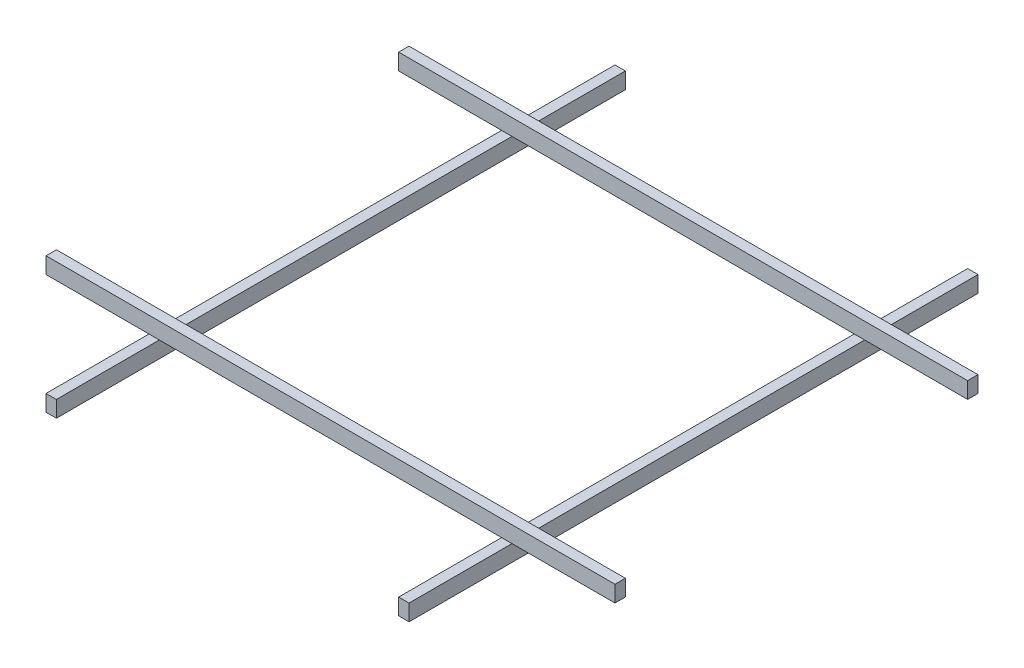
ISO-10303-21;
HEADER;
FILE_DESCRIPTION(('STEP AP214'),'2;1');
FILE_NAME('part.step','',(''),(''),'','','');
FILE_SCHEMA(('AUTOMOTIVE_DESIGN { 1 0 10303 214 1 1 1 1 }'));
ENDSEC;
DATA;
#1=APPLICATION_CONTEXT('core data for automotive mechanical design processes');
#2=APPLICATION_PROTOCOL_DEFINITION('international standard','automotive_design',2000,#1);
#3=PRODUCT_CONTEXT('',#1,'mechanical');
#4=PRODUCT('Part','Part','',(#3));
#5=PRODUCT_RELATED_PRODUCT_CATEGORY('part','',(#4));
#6=PRODUCT_DEFINITION_FORMATION('','',#4);
#7=PRODUCT_DEFINITION_CONTEXT('part definition',#1,'design');
#8=PRODUCT_DEFINITION('design','',#6,#7);
#9=PRODUCT_DEFINITION_SHAPE('','',#8);
#10=(LENGTH_UNIT() NAMED_UNIT(*) SI_UNIT(.MILLI.,.METRE.));
#11=(NAMED_UNIT(*) PLANE_ANGLE_UNIT() SI_UNIT($,.RADIAN.));
#12=(NAMED_UNIT(*) SI_UNIT($,.STERADIAN.) SOLID_ANGLE_UNIT());
#13=UNCERTAINTY_MEASURE_WITH_UNIT(LENGTH_MEASURE(1.E-05),#10,'distance_accuracy_value','');
#14=(GEOMETRIC_REPRESENTATION_CONTEXT(3) GLOBAL_UNCERTAINTY_ASSIGNED_CONTEXT((#13)) GLOBAL_UNIT_ASSIGNED_CONTEXT((#10,
#11,#12)) REPRESENTATION_CONTEXT('',''));
#15=CARTESIAN_POINT('',(0.,0.,0.));
#16=DIRECTION('',(0.,0.,1.));
#17=DIRECTION('',(1.,0.,0.));
#18=AXIS2_PLACEMENT_3D('',#15,#16,#17);
#19=CARTESIAN_POINT('',(4572.,209.55,-971.549999999999));
#20=DIRECTION('',(0.,0.,1.));
#21=DIRECTION('',(1.,0.,0.));
#22=AXIS2_PLACEMENT_3D('',#19,#20,#21);
#23=PLANE('',#22);
#24=DIRECTION('',(0.,1.,0.));
#25=VECTOR('',#24,1.);
#26=CARTESIAN_POINT('',(-304.8,209.55,-971.549999999999));
#27=LINE('',#26,#25);
#28=CARTESIAN_POINT('',(-304.8,69.85,-971.549999999999));
#29=VERTEX_POINT('',#28);
#30=CARTESIAN_POINT('',(-304.8,209.55,-971.549999999999));
#31=VERTEX_POINT('',#30);
#32=EDGE_CURVE('E129',#29,#31,#27,.T.);
#33=ORIENTED_EDGE('',*,*,#32,.T.);
#34=DIRECTION('',(-1.,0.,0.));
#35=VECTOR('',#34,1.);
#36=CARTESIAN_POINT('',(4572.,209.55,-971.549999999999));
#37=LINE('',#36,#35);
#38=CARTESIAN_POINT('',(4572.,209.55,-971.549999999999));
#39=VERTEX_POINT('',#38);
#40=EDGE_CURVE('E13',#39,#31,#37,.T.);
#41=ORIENTED_EDGE('',*,*,#40,.F.);
#42=DIRECTION('',(0.,1.,0.));
#43=VECTOR('',#42,1.);
#44=CARTESIAN_POINT('',(4572.,209.55,-971.549999999999));
#45=LINE('',#44,#43);
#46=CARTESIAN_POINT('',(4572.,69.85,-971.549999999999));
#47=VERTEX_POINT('',#46);
#48=EDGE_CURVE('E117',#47,#39,#45,.T.);
#49=ORIENTED_EDGE('',*,*,#48,.F.);
#50=DIRECTION('',(-1.,0.,0.));
#51=VECTOR('',#50,1.);
#52=CARTESIAN_POINT('',(4572.,69.85,-971.549999999999));
#53=LINE('',#52,#51);
#54=EDGE_CURVE('E125',#47,#29,#53,.T.);
#55=ORIENTED_EDGE('',*,*,#54,.T.);
#56=EDGE_LOOP('',(#33,#41,#49,#55));
#57=FACE_BOUND('',#56,.T.);
#58=ADVANCED_FACE('F66',(#57),#23,.F.);
#59=CARTESIAN_POINT('',(4572.,209.55,-882.649999999999));
#60=DIRECTION('',(0.,-1.,0.));
#61=DIRECTION('',(0.,0.,-1.));
#62=AXIS2_PLACEMENT_3D('',#59,#60,#61);
#63=PLANE('',#62);
#64=DIRECTION('',(0.,0.,1.));
#65=VECTOR('',#64,1.);
#66=CARTESIAN_POINT('',(-304.8,209.55,-882.649999999999));
#67=LINE('',#66,#65);
#68=CARTESIAN_POINT('',(-304.8,209.55,-882.649999999999));
#69=VERTEX_POINT('',#68);
#70=EDGE_CURVE('E121',#31,#69,#67,.T.);
#71=ORIENTED_EDGE('',*,*,#70,.T.);
#72=DIRECTION('',(-1.,0.,0.));
#73=VECTOR('',#72,1.);
#74=CARTESIAN_POINT('',(4572.,209.55,-882.649999999999));
#75=LINE('',#74,#73);
#76=CARTESIAN_POINT('',(4572.,209.55,-882.649999999999));
#77=VERTEX_POINT('',#76);
#78=EDGE_CURVE('E74',#77,#69,#75,.T.);
#79=ORIENTED_EDGE('',*,*,#78,.F.);
#80=DIRECTION('',(0.,0.,1.));
#81=VECTOR('',#80,1.);
#82=CARTESIAN_POINT('',(4572.,209.55,-882.649999999999));
#83=LINE('',#82,#81);
#84=EDGE_CURVE('E112',#39,#77,#83,.T.);
#85=ORIENTED_EDGE('',*,*,#84,.F.);
#86=ORIENTED_EDGE('',*,*,#40,.T.);
#87=EDGE_LOOP('',(#71,#79,#85,#86));
#88=FACE_BOUND('',#87,.T.);
#89=ADVANCED_FACE('F120',(#88),#63,.F.);
#90=CARTESIAN_POINT('',(4572.,209.55,-882.649999999999));
#91=DIRECTION('',(0.,0.,-1.));
#92=DIRECTION('',(-1.,0.,0.));
#93=AXIS2_PLACEMENT_3D('',#90,#91,#92);
#94=PLANE('',#93);
#95=DIRECTION('',(0.,-1.,0.));
#96=VECTOR('',#95,1.);
#97=CARTESIAN_POINT('',(-304.8,209.55,-882.649999999999));
#98=LINE('',#97,#96);
#99=CARTESIAN_POINT('',(-304.8,69.85,-882.649999999999));
#100=VERTEX_POINT('',#99);
#101=EDGE_CURVE('E99',#69,#100,#98,.T.);
#102=ORIENTED_EDGE('',*,*,#101,.T.);
#103=DIRECTION('',(-1.,0.,0.));
#104=VECTOR('',#103,1.);
#105=CARTESIAN_POINT('',(4572.,69.85,-882.649999999999));
#106=LINE('',#105,#104);
#107=CARTESIAN_POINT('',(4572.,69.85,-882.649999999999));
#108=VERTEX_POINT('',#107);
#109=EDGE_CURVE('E122',#108,#100,#106,.T.);
#110=ORIENTED_EDGE('',*,*,#109,.F.);
#111=DIRECTION('',(0.,-1.,0.));
#112=VECTOR('',#111,1.);
#113=CARTESIAN_POINT('',(4572.,209.55,-882.649999999999));
#114=LINE('',#113,#112);
#115=EDGE_CURVE('E115',#77,#108,#114,.T.);
#116=ORIENTED_EDGE('',*,*,#115,.F.);
#117=ORIENTED_EDGE('',*,*,#78,.T.);
#118=EDGE_LOOP('',(#102,#110,#116,#117));
#119=FACE_BOUND('',#118,.T.);
#120=ADVANCED_FACE('F123',(#119),#94,.F.);
#121=CARTESIAN_POINT('',(4572.,69.85,-882.649999999999));
#122=DIRECTION('',(0.,1.,0.));
#123=DIRECTION('',(0.,0.,1.));
#124=AXIS2_PLACEMENT_3D('',#121,#122,#123);
#125=PLANE('',#124);
#126=DIRECTION('',(0.,0.,-1.));
#127=VECTOR('',#126,1.);
#128=CARTESIAN_POINT('',(-304.8,69.85,-882.649999999999));
#129=LINE('',#128,#127);
#130=EDGE_CURVE('E105',#100,#29,#129,.T.);
#131=ORIENTED_EDGE('',*,*,#130,.T.);
#132=ORIENTED_EDGE('',*,*,#54,.F.);
#133=DIRECTION('',(0.,0.,-1.));
#134=VECTOR('',#133,1.);
#135=CARTESIAN_POINT('',(4572.,69.85,-882.649999999999));
#136=LINE('',#135,#134);
#137=EDGE_CURVE('E82',#108,#47,#136,.T.);
#138=ORIENTED_EDGE('',*,*,#137,.F.);
#139=ORIENTED_EDGE('',*,*,#109,.T.);
#140=EDGE_LOOP('',(#131,#132,#138,#139));
#141=FACE_BOUND('',#140,.T.);
#142=ADVANCED_FACE('F136',(#141),#125,.F.);
#143=CARTESIAN_POINT('',(4572.,139.7,-1549.4));
#144=DIRECTION('',(1.,0.,0.));
#145=DIRECTION('',(0.,0.,-1.));
#146=AXIS2_PLACEMENT_3D('',#143,#144,#145);
#147=PLANE('',#146);
#148=ORIENTED_EDGE('',*,*,#48,.T.);
#149=ORIENTED_EDGE('',*,*,#84,.T.);
#150=ORIENTED_EDGE('',*,*,#115,.T.);
#151=ORIENTED_EDGE('',*,*,#137,.T.);
#152=EDGE_LOOP('',(#148,#149,#150,#151));
#153=FACE_BOUND('',#152,.T.);
#154=ADVANCED_FACE('F113',(#153),#147,.T.);
#155=CARTESIAN_POINT('',(-304.8,139.7,-1549.4));
#156=DIRECTION('',(1.,0.,0.));
#157=DIRECTION('',(0.,0.,-1.));
#158=AXIS2_PLACEMENT_3D('',#155,#156,#157);
#159=PLANE('',#158);
#160=ORIENTED_EDGE('',*,*,#32,.F.);
#161=ORIENTED_EDGE('',*,*,#130,.F.);
#162=ORIENTED_EDGE('',*,*,#101,.F.);
#163=ORIENTED_EDGE('',*,*,#70,.F.);
#164=EDGE_LOOP('',(#160,#161,#162,#163));
#165=FACE_BOUND('',#164,.T.);
#166=ADVANCED_FACE('F139',(#165),#159,.F.);
#167=CLOSED_SHELL('',(#58,#89,#120,#142,#154,#166));
#168=MANIFOLD_SOLID_BREP('B2',#167);
#169=CARTESIAN_POINT('',(4572.,209.55,-3994.15));
#170=DIRECTION('',(0.,0.,1.));
#171=DIRECTION('',(1.,0.,0.));
#172=AXIS2_PLACEMENT_3D('',#169,#170,#171);
#173=PLANE('',#172);
#174=DIRECTION('',(0.,1.,0.));
#175=VECTOR('',#174,1.);
#176=CARTESIAN_POINT('',(-304.8,209.55,-3994.15));
#177=LINE('',#176,#175);
#178=CARTESIAN_POINT('',(-304.8,69.85,-3994.15));
#179=VERTEX_POINT('',#178);
#180=CARTESIAN_POINT('',(-304.8,209.55,-3994.15));
#181=VERTEX_POINT('',#180);
#182=EDGE_CURVE('E287',#179,#181,#177,.T.);
#183=ORIENTED_EDGE('',*,*,#182,.T.);
#184=DIRECTION('',(-1.,0.,0.));
#185=VECTOR('',#184,1.);
#186=CARTESIAN_POINT('',(4572.,209.55,-3994.15));
#187=LINE('',#186,#185);
#188=CARTESIAN_POINT('',(4572.,209.55,-3994.15));
#189=VERTEX_POINT('',#188);
#190=EDGE_CURVE('E64',#189,#181,#187,.T.);
#191=ORIENTED_EDGE('',*,*,#190,.F.);
#192=DIRECTION('',(0.,1.,0.));
#193=VECTOR('',#192,1.);
#194=CARTESIAN_POINT('',(4572.,209.55,-3994.15));
#195=LINE('',#194,#193);
#196=CARTESIAN_POINT('',(4572.,69.85,-3994.15));
#197=VERTEX_POINT('',#196);
#198=EDGE_CURVE('E275',#197,#189,#195,.T.);
#199=ORIENTED_EDGE('',*,*,#198,.F.);
#200=DIRECTION('',(-1.,0.,0.));
#201=VECTOR('',#200,1.);
#202=CARTESIAN_POINT('',(4572.,69.85,-3994.15));
#203=LINE('',#202,#201);
#204=EDGE_CURVE('E283',#197,#179,#203,.T.);
#205=ORIENTED_EDGE('',*,*,#204,.T.);
#206=EDGE_LOOP('',(#183,#191,#199,#205));
#207=FACE_BOUND('',#206,.T.);
#208=ADVANCED_FACE('F224',(#207),#173,.F.);
#209=CARTESIAN_POINT('',(4572.,209.55,-3905.25));
#210=DIRECTION('',(0.,-1.,0.));
#211=DIRECTION('',(0.,0.,-1.));
#212=AXIS2_PLACEMENT_3D('',#209,#210,#211);
#213=PLANE('',#212);
#214=DIRECTION('',(0.,0.,1.));
#215=VECTOR('',#214,1.);
#216=CARTESIAN_POINT('',(-304.8,209.55,-3905.25));
#217=LINE('',#216,#215);
#218=CARTESIAN_POINT('',(-304.8,209.55,-3905.25));
#219=VERTEX_POINT('',#218);
#220=EDGE_CURVE('E279',#181,#219,#217,.T.);
#221=ORIENTED_EDGE('',*,*,#220,.T.);
#222=DIRECTION('',(-1.,0.,0.));
#223=VECTOR('',#222,1.);
#224=CARTESIAN_POINT('',(4572.,209.55,-3905.25));
#225=LINE('',#224,#223);
#226=CARTESIAN_POINT('',(4572.,209.55,-3905.25));
#227=VERTEX_POINT('',#226);
#228=EDGE_CURVE('E232',#227,#219,#225,.T.);
#229=ORIENTED_EDGE('',*,*,#228,.F.);
#230=DIRECTION('',(0.,0.,1.));
#231=VECTOR('',#230,1.);
#232=CARTESIAN_POINT('',(4572.,209.55,-3905.25));
#233=LINE('',#232,#231);
#234=EDGE_CURVE('E270',#189,#227,#233,.T.);
#235=ORIENTED_EDGE('',*,*,#234,.F.);
#236=ORIENTED_EDGE('',*,*,#190,.T.);
#237=EDGE_LOOP('',(#221,#229,#235,#236));
#238=FACE_BOUND('',#237,.T.);
#239=ADVANCED_FACE('F278',(#238),#213,.F.);
#240=CARTESIAN_POINT('',(4572.,209.55,-3905.25));
#241=DIRECTION('',(0.,0.,-1.));
#242=DIRECTION('',(-1.,0.,0.));
#243=AXIS2_PLACEMENT_3D('',#240,#241,#242);
#244=PLANE('',#243);
#245=DIRECTION('',(0.,-1.,0.));
#246=VECTOR('',#245,1.);
#247=CARTESIAN_POINT('',(-304.8,209.55,-3905.25));
#248=LINE('',#247,#246);
#249=CARTESIAN_POINT('',(-304.8,69.85,-3905.25));
#250=VERTEX_POINT('',#249);
#251=EDGE_CURVE('E257',#219,#250,#248,.T.);
#252=ORIENTED_EDGE('',*,*,#251,.T.);
#253=DIRECTION('',(-1.,0.,0.));
#254=VECTOR('',#253,1.);
#255=CARTESIAN_POINT('',(4572.,69.85,-3905.25));
#256=LINE('',#255,#254);
#257=CARTESIAN_POINT('',(4572.,69.85,-3905.25));
#258=VERTEX_POINT('',#257);
#259=EDGE_CURVE('E280',#258,#250,#256,.T.);
#260=ORIENTED_EDGE('',*,*,#259,.F.);
#261=DIRECTION('',(0.,-1.,0.));
#262=VECTOR('',#261,1.);
#263=CARTESIAN_POINT('',(4572.,209.55,-3905.25));
#264=LINE('',#263,#262);
#265=EDGE_CURVE('E273',#227,#258,#264,.T.);
#266=ORIENTED_EDGE('',*,*,#265,.F.);
#267=ORIENTED_EDGE('',*,*,#228,.T.);
#268=EDGE_LOOP('',(#252,#260,#266,#267));
#269=FACE_BOUND('',#268,.T.);
#270=ADVANCED_FACE('F281',(#269),#244,.F.);
#271=CARTESIAN_POINT('',(4572.,69.85,-3905.25));
#272=DIRECTION('',(0.,1.,0.));
#273=DIRECTION('',(0.,0.,1.));
#274=AXIS2_PLACEMENT_3D('',#271,#272,#273);
#275=PLANE('',#274);
#276=DIRECTION('',(0.,0.,-1.));
#277=VECTOR('',#276,1.);
#278=CARTESIAN_POINT('',(-304.8,69.85,-3905.25));
#279=LINE('',#278,#277);
#280=EDGE_CURVE('E263',#250,#179,#279,.T.);
#281=ORIENTED_EDGE('',*,*,#280,.T.);
#282=ORIENTED_EDGE('',*,*,#204,.F.);
#283=DIRECTION('',(0.,0.,-1.));
#284=VECTOR('',#283,1.);
#285=CARTESIAN_POINT('',(4572.,69.85,-3905.25));
#286=LINE('',#285,#284);
#287=EDGE_CURVE('E240',#258,#197,#286,.T.);
#288=ORIENTED_EDGE('',*,*,#287,.F.);
#289=ORIENTED_EDGE('',*,*,#259,.T.);
#290=EDGE_LOOP('',(#281,#282,#288,#289));
#291=FACE_BOUND('',#290,.T.);
#292=ADVANCED_FACE('F294',(#291),#275,.F.);
#293=CARTESIAN_POINT('',(4572.,139.7,-4572.));
#294=DIRECTION('',(1.,0.,0.));
#295=DIRECTION('',(0.,0.,-1.));
#296=AXIS2_PLACEMENT_3D('',#293,#294,#295);
#297=PLANE('',#296);
#298=ORIENTED_EDGE('',*,*,#198,.T.);
#299=ORIENTED_EDGE('',*,*,#234,.T.);
#300=ORIENTED_EDGE('',*,*,#265,.T.);
#301=ORIENTED_EDGE('',*,*,#287,.T.);
#302=EDGE_LOOP('',(#298,#299,#300,#301));
#303=FACE_BOUND('',#302,.T.);
#304=ADVANCED_FACE('F271',(#303),#297,.T.);
#305=CARTESIAN_POINT('',(-304.8,139.7,-4572.));
#306=DIRECTION('',(1.,0.,0.));
#307=DIRECTION('',(0.,0.,-1.));
#308=AXIS2_PLACEMENT_3D('',#305,#306,#307);
#309=PLANE('',#308);
#310=ORIENTED_EDGE('',*,*,#182,.F.);
#311=ORIENTED_EDGE('',*,*,#280,.F.);
#312=ORIENTED_EDGE('',*,*,#251,.F.);
#313=ORIENTED_EDGE('',*,*,#220,.F.);
#314=EDGE_LOOP('',(#310,#311,#312,#313));
#315=FACE_BOUND('',#314,.T.);
#316=ADVANCED_FACE('F297',(#315),#309,.F.);
#317=CLOSED_SHELL('',(#208,#239,#270,#292,#304,#316));
#318=MANIFOLD_SOLID_BREP('B7',#317);
#319=CARTESIAN_POINT('',(3600.45,69.85,-4876.8));
#320=DIRECTION('',(1.,0.,0.));
#321=DIRECTION('',(0.,0.,-1.));
#322=AXIS2_PLACEMENT_3D('',#319,#320,#321);
#323=PLANE('',#322);
#324=DIRECTION('',(0.,1.,0.));
#325=VECTOR('',#324,1.);
#326=CARTESIAN_POINT('',(3600.45,69.85,1.14314655466409E-13));
#327=LINE('',#326,#325);
#328=CARTESIAN_POINT('',(3600.45,-69.85,1.14314655466409E-13));
#329=VERTEX_POINT('',#328);
#330=CARTESIAN_POINT('',(3600.45,69.85,1.14314655466409E-13));
#331=VERTEX_POINT('',#330);
#332=EDGE_CURVE('E444',#329,#331,#327,.T.);
#333=ORIENTED_EDGE('',*,*,#332,.T.);
#334=DIRECTION('',(0.,0.,1.));
#335=VECTOR('',#334,1.);
#336=CARTESIAN_POINT('',(3600.45,69.85,-4876.8));
#337=LINE('',#336,#335);
#338=CARTESIAN_POINT('',(3600.45,69.85,-4876.8));
#339=VERTEX_POINT('',#338);
#340=EDGE_CURVE('E222',#339,#331,#337,.T.);
#341=ORIENTED_EDGE('',*,*,#340,.F.);
#342=DIRECTION('',(0.,1.,0.));
#343=VECTOR('',#342,1.);
#344=CARTESIAN_POINT('',(3600.45,69.85,-4876.8));
#345=LINE('',#344,#343);
#346=CARTESIAN_POINT('',(3600.45,-69.85,-4876.8));
#347=VERTEX_POINT('',#346);
#348=EDGE_CURVE('E432',#347,#339,#345,.T.);
#349=ORIENTED_EDGE('',*,*,#348,.F.);
#350=DIRECTION('',(0.,0.,1.));
#351=VECTOR('',#350,1.);
#352=CARTESIAN_POINT('',(3600.45,-69.85,-4876.8));
#353=LINE('',#352,#351);
#354=EDGE_CURVE('E440',#347,#329,#353,.T.);
#355=ORIENTED_EDGE('',*,*,#354,.T.);
#356=EDGE_LOOP('',(#333,#341,#349,#355));
#357=FACE_BOUND('',#356,.T.);
#358=ADVANCED_FACE('F381',(#357),#323,.F.);
#359=CARTESIAN_POINT('',(3689.35,69.85,-4876.8));
#360=DIRECTION('',(0.,-1.,0.));
#361=DIRECTION('',(0.,0.,-1.));
#362=AXIS2_PLACEMENT_3D('',#359,#360,#361);
#363=PLANE('',#362);
#364=DIRECTION('',(1.,0.,0.));
#365=VECTOR('',#364,1.);
#366=CARTESIAN_POINT('',(3689.35,69.85,1.14314655466409E-13));
#367=LINE('',#366,#365);
#368=CARTESIAN_POINT('',(3689.35,69.85,1.14314655466409E-13));
#369=VERTEX_POINT('',#368);
#370=EDGE_CURVE('E436',#331,#369,#367,.T.);
#371=ORIENTED_EDGE('',*,*,#370,.T.);
#372=DIRECTION('',(0.,0.,1.));
#373=VECTOR('',#372,1.);
#374=CARTESIAN_POINT('',(3689.35,69.85,-4876.8));
#375=LINE('',#374,#373);
#376=CARTESIAN_POINT('',(3689.35,69.85,-4876.8));
#377=VERTEX_POINT('',#376);
#378=EDGE_CURVE('E389',#377,#369,#375,.T.);
#379=ORIENTED_EDGE('',*,*,#378,.F.);
#380=DIRECTION('',(1.,0.,0.));
#381=VECTOR('',#380,1.);
#382=CARTESIAN_POINT('',(3689.35,69.85,-4876.8));
#383=LINE('',#382,#381);
#384=EDGE_CURVE('E427',#339,#377,#383,.T.);
#385=ORIENTED_EDGE('',*,*,#384,.F.);
#386=ORIENTED_EDGE('',*,*,#340,.T.);
#387=EDGE_LOOP('',(#371,#379,#385,#386));
#388=FACE_BOUND('',#387,.T.);
#389=ADVANCED_FACE('F435',(#388),#363,.F.);
#390=CARTESIAN_POINT('',(3689.35,69.85,-4876.8));
#391=DIRECTION('',(-1.,0.,0.));
#392=DIRECTION('',(0.,0.,1.));
#393=AXIS2_PLACEMENT_3D('',#390,#391,#392);
#394=PLANE('',#393);
#395=DIRECTION('',(0.,-1.,0.));
#396=VECTOR('',#395,1.);
#397=CARTESIAN_POINT('',(3689.35,69.85,1.14314655466409E-13));
#398=LINE('',#397,#396);
#399=CARTESIAN_POINT('',(3689.35,-69.85,1.14314655466409E-13));
#400=VERTEX_POINT('',#399);
#401=EDGE_CURVE('E414',#369,#400,#398,.T.);
#402=ORIENTED_EDGE('',*,*,#401,.T.);
#403=DIRECTION('',(0.,0.,1.));
#404=VECTOR('',#403,1.);
#405=CARTESIAN_POINT('',(3689.35,-69.85,-4876.8));
#406=LINE('',#405,#404);
#407=CARTESIAN_POINT('',(3689.35,-69.85,-4876.8));
#408=VERTEX_POINT('',#407);
#409=EDGE_CURVE('E437',#408,#400,#406,.T.);
#410=ORIENTED_EDGE('',*,*,#409,.F.);
#411=DIRECTION('',(0.,-1.,0.));
#412=VECTOR('',#411,1.);
#413=CARTESIAN_POINT('',(3689.35,69.85,-4876.8));
#414=LINE('',#413,#412);
#415=EDGE_CURVE('E430',#377,#408,#414,.T.);
#416=ORIENTED_EDGE('',*,*,#415,.F.);
#417=ORIENTED_EDGE('',*,*,#378,.T.);
#418=EDGE_LOOP('',(#402,#410,#416,#417));
#419=FACE_BOUND('',#418,.T.);
#420=ADVANCED_FACE('F438',(#419),#394,.F.);
#421=CARTESIAN_POINT('',(3689.35,-69.85,-4876.8));
#422=DIRECTION('',(0.,1.,0.));
#423=DIRECTION('',(0.,0.,1.));
#424=AXIS2_PLACEMENT_3D('',#421,#422,#423);
#425=PLANE('',#424);
#426=DIRECTION('',(-1.,0.,0.));
#427=VECTOR('',#426,1.);
#428=CARTESIAN_POINT('',(3689.35,-69.85,1.14314655466409E-13));
#429=LINE('',#428,#427);
#430=EDGE_CURVE('E420',#400,#329,#429,.T.);
#431=ORIENTED_EDGE('',*,*,#430,.T.);
#432=ORIENTED_EDGE('',*,*,#354,.F.);
#433=DIRECTION('',(-1.,0.,0.));
#434=VECTOR('',#433,1.);
#435=CARTESIAN_POINT('',(3689.35,-69.85,-4876.8));
#436=LINE('',#435,#434);
#437=EDGE_CURVE('E397',#408,#347,#436,.T.);
#438=ORIENTED_EDGE('',*,*,#437,.F.);
#439=ORIENTED_EDGE('',*,*,#409,.T.);
#440=EDGE_LOOP('',(#431,#432,#438,#439));
#441=FACE_BOUND('',#440,.T.);
#442=ADVANCED_FACE('F451',(#441),#425,.F.);
#443=CARTESIAN_POINT('',(3022.6,0.,-4876.8));
#444=DIRECTION('',(0.,0.,-1.));
#445=DIRECTION('',(-1.,0.,0.));
#446=AXIS2_PLACEMENT_3D('',#443,#444,#445);
#447=PLANE('',#446);
#448=ORIENTED_EDGE('',*,*,#348,.T.);
#449=ORIENTED_EDGE('',*,*,#384,.T.);
#450=ORIENTED_EDGE('',*,*,#415,.T.);
#451=ORIENTED_EDGE('',*,*,#437,.T.);
#452=EDGE_LOOP('',(#448,#449,#450,#451));
#453=FACE_BOUND('',#452,.T.);
#454=ADVANCED_FACE('F428',(#453),#447,.T.);
#455=CARTESIAN_POINT('',(3022.6,0.,1.14314655466409E-13));
#456=DIRECTION('',(0.,0.,-1.));
#457=DIRECTION('',(-1.,0.,0.));
#458=AXIS2_PLACEMENT_3D('',#455,#456,#457);
#459=PLANE('',#458);
#460=ORIENTED_EDGE('',*,*,#332,.F.);
#461=ORIENTED_EDGE('',*,*,#430,.F.);
#462=ORIENTED_EDGE('',*,*,#401,.F.);
#463=ORIENTED_EDGE('',*,*,#370,.F.);
#464=EDGE_LOOP('',(#460,#461,#462,#463));
#465=FACE_BOUND('',#464,.T.);
#466=ADVANCED_FACE('F454',(#465),#459,.F.);
#467=CLOSED_SHELL('',(#358,#389,#420,#442,#454,#466));
#468=MANIFOLD_SOLID_BREP('B58',#467);
#469=CARTESIAN_POINT('',(577.85,69.85,-4876.8));
#470=DIRECTION('',(1.,0.,0.));
#471=DIRECTION('',(0.,0.,-1.));
#472=AXIS2_PLACEMENT_3D('',#469,#470,#471);
#473=PLANE('',#472);
#474=DIRECTION('',(0.,1.,0.));
#475=VECTOR('',#474,1.);
#476=CARTESIAN_POINT('',(577.85,69.85,8.88178419700125E-13));
#477=LINE('',#476,#475);
#478=CARTESIAN_POINT('',(577.85,-69.85,8.88178419700125E-13));
#479=VERTEX_POINT('',#478);
#480=CARTESIAN_POINT('',(577.85,69.85,8.88178419700125E-13));
#481=VERTEX_POINT('',#480);
#482=EDGE_CURVE('E592',#479,#481,#477,.T.);
#483=ORIENTED_EDGE('',*,*,#482,.T.);
#484=DIRECTION('',(0.,0.,1.));
#485=VECTOR('',#484,1.);
#486=CARTESIAN_POINT('',(577.85,69.85,-4876.8));
#487=LINE('',#486,#485);
#488=CARTESIAN_POINT('',(577.85,69.85,-4876.8));
#489=VERTEX_POINT('',#488);
#490=EDGE_CURVE('E379',#489,#481,#487,.T.);
#491=ORIENTED_EDGE('',*,*,#490,.F.);
#492=DIRECTION('',(0.,1.,0.));
#493=VECTOR('',#492,1.);
#494=CARTESIAN_POINT('',(577.85,69.85,-4876.8));
#495=LINE('',#494,#493);
#496=CARTESIAN_POINT('',(577.85,-69.85,-4876.8));
#497=VERTEX_POINT('',#496);
#498=EDGE_CURVE('E580',#497,#489,#495,.T.);
#499=ORIENTED_EDGE('',*,*,#498,.F.);
#500=DIRECTION('',(0.,0.,1.));
#501=VECTOR('',#500,1.);
#502=CARTESIAN_POINT('',(577.85,-69.85,-4876.8));
#503=LINE('',#502,#501);
#504=EDGE_CURVE('E588',#497,#479,#503,.T.);
#505=ORIENTED_EDGE('',*,*,#504,.T.);
#506=EDGE_LOOP('',(#483,#491,#499,#505));
#507=FACE_BOUND('',#506,.T.);
#508=ADVANCED_FACE('F529',(#507),#473,.F.);
#509=CARTESIAN_POINT('',(666.75,69.85,-4876.8));
#510=DIRECTION('',(0.,-1.,0.));
#511=DIRECTION('',(0.,0.,-1.));
#512=AXIS2_PLACEMENT_3D('',#509,#510,#511);
#513=PLANE('',#512);
#514=DIRECTION('',(1.,0.,0.));
#515=VECTOR('',#514,1.);
#516=CARTESIAN_POINT('',(666.75,69.85,8.88178419700125E-13));
#517=LINE('',#516,#515);
#518=CARTESIAN_POINT('',(666.75,69.85,8.88178419700125E-13));
#519=VERTEX_POINT('',#518);
#520=EDGE_CURVE('E584',#481,#519,#517,.T.);
#521=ORIENTED_EDGE('',*,*,#520,.T.);
#522=DIRECTION('',(0.,0.,1.));
#523=VECTOR('',#522,1.);
#524=CARTESIAN_POINT('',(666.75,69.85,-4876.8));
#525=LINE('',#524,#523);
#526=CARTESIAN_POINT('',(666.75,69.85,-4876.8));
#527=VERTEX_POINT('',#526);
#528=EDGE_CURVE('E537',#527,#519,#525,.T.);
#529=ORIENTED_EDGE('',*,*,#528,.F.);
#530=DIRECTION('',(1.,0.,0.));
#531=VECTOR('',#530,1.);
#532=CARTESIAN_POINT('',(666.75,69.85,-4876.8));
#533=LINE('',#532,#531);
#534=EDGE_CURVE('E575',#489,#527,#533,.T.);
#535=ORIENTED_EDGE('',*,*,#534,.F.);
#536=ORIENTED_EDGE('',*,*,#490,.T.);
#537=EDGE_LOOP('',(#521,#529,#535,#536));
#538=FACE_BOUND('',#537,.T.);
#539=ADVANCED_FACE('F583',(#538),#513,.F.);
#540=CARTESIAN_POINT('',(666.75,69.85,-4876.8));
#541=DIRECTION('',(-1.,0.,0.));
#542=DIRECTION('',(0.,0.,1.));
#543=AXIS2_PLACEMENT_3D('',#540,#541,#542);
#544=PLANE('',#543);
#545=DIRECTION('',(0.,-1.,0.));
#546=VECTOR('',#545,1.);
#547=CARTESIAN_POINT('',(666.75,69.85,8.88178419700125E-13));
#548=LINE('',#547,#546);
#549=CARTESIAN_POINT('',(666.75,-69.85,8.88178419700125E-13));
#550=VERTEX_POINT('',#549);
#551=EDGE_CURVE('E562',#519,#550,#548,.T.);
#552=ORIENTED_EDGE('',*,*,#551,.T.);
#553=DIRECTION('',(0.,0.,1.));
#554=VECTOR('',#553,1.);
#555=CARTESIAN_POINT('',(666.75,-69.85,-4876.8));
#556=LINE('',#555,#554);
#557=CARTESIAN_POINT('',(666.75,-69.85,-4876.8));
#558=VERTEX_POINT('',#557);
#559=EDGE_CURVE('E585',#558,#550,#556,.T.);
#560=ORIENTED_EDGE('',*,*,#559,.F.);
#561=DIRECTION('',(0.,-1.,0.));
#562=VECTOR('',#561,1.);
#563=CARTESIAN_POINT('',(666.75,69.85,-4876.8));
#564=LINE('',#563,#562);
#565=EDGE_CURVE('E578',#527,#558,#564,.T.);
#566=ORIENTED_EDGE('',*,*,#565,.F.);
#567=ORIENTED_EDGE('',*,*,#528,.T.);
#568=EDGE_LOOP('',(#552,#560,#566,#567));
#569=FACE_BOUND('',#568,.T.);
#570=ADVANCED_FACE('F586',(#569),#544,.F.);
#571=CARTESIAN_POINT('',(666.75,-69.85,-4876.8));
#572=DIRECTION('',(0.,1.,0.));
#573=DIRECTION('',(0.,0.,1.));
#574=AXIS2_PLACEMENT_3D('',#571,#572,#573);
#575=PLANE('',#574);
#576=DIRECTION('',(-1.,0.,0.));
#577=VECTOR('',#576,1.);
#578=CARTESIAN_POINT('',(666.75,-69.85,8.88178419700125E-13));
#579=LINE('',#578,#577);
#580=EDGE_CURVE('E568',#550,#479,#579,.T.);
#581=ORIENTED_EDGE('',*,*,#580,.T.);
#582=ORIENTED_EDGE('',*,*,#504,.F.);
#583=DIRECTION('',(-1.,0.,0.));
#584=VECTOR('',#583,1.);
#585=CARTESIAN_POINT('',(666.75,-69.85,-4876.8));
#586=LINE('',#585,#584);
#587=EDGE_CURVE('E545',#558,#497,#586,.T.);
#588=ORIENTED_EDGE('',*,*,#587,.F.);
#589=ORIENTED_EDGE('',*,*,#559,.T.);
#590=EDGE_LOOP('',(#581,#582,#588,#589));
#591=FACE_BOUND('',#590,.T.);
#592=ADVANCED_FACE('F599',(#591),#575,.F.);
#593=CARTESIAN_POINT('',(0.,0.,-4876.8));
#594=DIRECTION('',(0.,0.,-1.));
#595=DIRECTION('',(-1.,0.,0.));
#596=AXIS2_PLACEMENT_3D('',#593,#594,#595);
#597=PLANE('',#596);
#598=ORIENTED_EDGE('',*,*,#498,.T.);
#599=ORIENTED_EDGE('',*,*,#534,.T.);
#600=ORIENTED_EDGE('',*,*,#565,.T.);
#601=ORIENTED_EDGE('',*,*,#587,.T.);
#602=EDGE_LOOP('',(#598,#599,#600,#601));
#603=FACE_BOUND('',#602,.T.);
#604=ADVANCED_FACE('F576',(#603),#597,.T.);
#605=CARTESIAN_POINT('',(0.,0.,8.88178419700125E-13));
#606=DIRECTION('',(0.,0.,-1.));
#607=DIRECTION('',(-1.,0.,0.));
#608=AXIS2_PLACEMENT_3D('',#605,#606,#607);
#609=PLANE('',#608);
#610=ORIENTED_EDGE('',*,*,#482,.F.);
#611=ORIENTED_EDGE('',*,*,#580,.F.);
#612=ORIENTED_EDGE('',*,*,#551,.F.);
#613=ORIENTED_EDGE('',*,*,#520,.F.);
#614=EDGE_LOOP('',(#610,#611,#612,#613));
#615=FACE_BOUND('',#614,.T.);
#616=ADVANCED_FACE('F602',(#615),#609,.F.);
#617=CLOSED_SHELL('',(#508,#539,#570,#592,#604,#616));
#618=MANIFOLD_SOLID_BREP('B216',#617);
#619=ADVANCED_BREP_SHAPE_REPRESENTATION('',(#18,#168,#318,#468,#618),#14);
#620=SHAPE_DEFINITION_REPRESENTATION(#9,#619);
ENDSEC;
END-ISO-10303-21;
